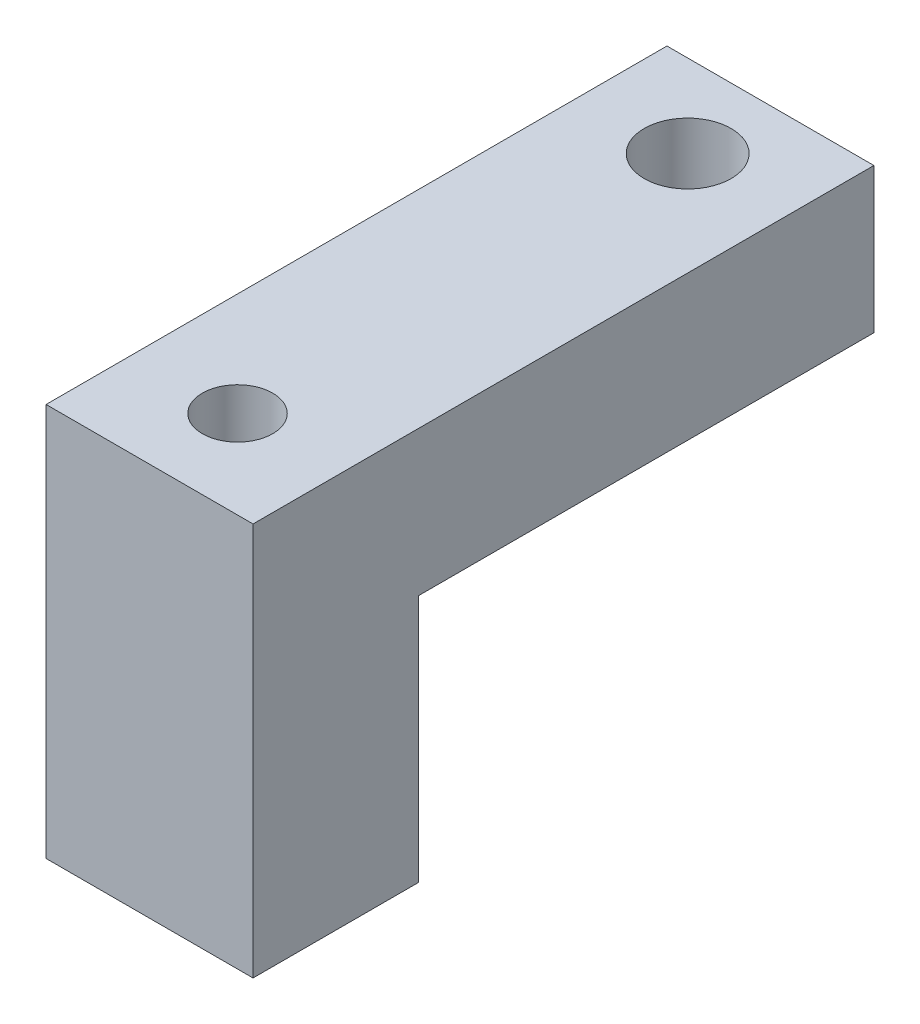
ISO-10303-21;
HEADER;
FILE_DESCRIPTION(('STEP AP214'),'2;1');
FILE_NAME('part.step','',(''),(''),'','','');
FILE_SCHEMA(('AUTOMOTIVE_DESIGN { 1 0 10303 214 1 1 1 1 }'));
ENDSEC;
DATA;
#1=APPLICATION_CONTEXT('core data for automotive mechanical design processes');
#2=APPLICATION_PROTOCOL_DEFINITION('international standard','automotive_design',2000,#1);
#3=PRODUCT_CONTEXT('',#1,'mechanical');
#4=PRODUCT('Part','Part','',(#3));
#5=PRODUCT_RELATED_PRODUCT_CATEGORY('part','',(#4));
#6=PRODUCT_DEFINITION_FORMATION('','',#4);
#7=PRODUCT_DEFINITION_CONTEXT('part definition',#1,'design');
#8=PRODUCT_DEFINITION('design','',#6,#7);
#9=PRODUCT_DEFINITION_SHAPE('','',#8);
#10=(LENGTH_UNIT() NAMED_UNIT(*) SI_UNIT(.MILLI.,.METRE.));
#11=(NAMED_UNIT(*) PLANE_ANGLE_UNIT() SI_UNIT($,.RADIAN.));
#12=(NAMED_UNIT(*) SI_UNIT($,.STERADIAN.) SOLID_ANGLE_UNIT());
#13=UNCERTAINTY_MEASURE_WITH_UNIT(LENGTH_MEASURE(1.E-05),#10,'distance_accuracy_value','');
#14=(GEOMETRIC_REPRESENTATION_CONTEXT(3) GLOBAL_UNCERTAINTY_ASSIGNED_CONTEXT((#13)) GLOBAL_UNIT_ASSIGNED_CONTEXT((#10,
#11,#12)) REPRESENTATION_CONTEXT('',''));
#15=CARTESIAN_POINT('',(0.,0.,0.));
#16=DIRECTION('',(0.,0.,1.));
#17=DIRECTION('',(1.,0.,0.));
#18=AXIS2_PLACEMENT_3D('',#15,#16,#17);
#19=CARTESIAN_POINT('',(0.,7.,0.));
#20=DIRECTION('',(0.,-1.,0.));
#21=DIRECTION('',(0.,0.,-1.));
#22=AXIS2_PLACEMENT_3D('',#19,#20,#21);
#23=PLANE('',#22);
#24=CARTESIAN_POINT('',(5.,7.,-4.25));
#25=DIRECTION('',(0.,1.,0.));
#26=DIRECTION('',(0.,0.,1.));
#27=AXIS2_PLACEMENT_3D('',#24,#25,#26);
#28=CIRCLE('',#27,1.7);
#29=CARTESIAN_POINT('',(5.,7.,-2.55));
#30=VERTEX_POINT('',#29);
#31=EDGE_CURVE('E153',#30,#30,#28,.T.);
#32=ORIENTED_EDGE('',*,*,#31,.F.);
#33=EDGE_LOOP('',(#32));
#34=FACE_BOUND('',#33,.T.);
#35=DIRECTION('',(0.,0.,1.));
#36=VECTOR('',#35,1.);
#37=CARTESIAN_POINT('',(0.,7.,0.));
#38=LINE('',#37,#36);
#39=CARTESIAN_POINT('',(0.,7.,-30.));
#40=VERTEX_POINT('',#39);
#41=CARTESIAN_POINT('',(0.,7.,0.));
#42=VERTEX_POINT('',#41);
#43=EDGE_CURVE('E131',#40,#42,#38,.T.);
#44=ORIENTED_EDGE('',*,*,#43,.T.);
#45=DIRECTION('',(1.,0.,0.));
#46=VECTOR('',#45,1.);
#47=CARTESIAN_POINT('',(0.,7.,0.));
#48=LINE('',#47,#46);
#49=CARTESIAN_POINT('',(10.,7.,0.));
#50=VERTEX_POINT('',#49);
#51=EDGE_CURVE('E83',#42,#50,#48,.T.);
#52=ORIENTED_EDGE('',*,*,#51,.T.);
#53=DIRECTION('',(0.,0.,-1.));
#54=VECTOR('',#53,1.);
#55=CARTESIAN_POINT('',(10.,7.,0.));
#56=LINE('',#55,#54);
#57=CARTESIAN_POINT('',(10.,7.,-30.));
#58=VERTEX_POINT('',#57);
#59=EDGE_CURVE('E134',#50,#58,#56,.T.);
#60=ORIENTED_EDGE('',*,*,#59,.T.);
#61=DIRECTION('',(-1.,0.,0.));
#62=VECTOR('',#61,1.);
#63=CARTESIAN_POINT('',(0.,7.,-30.));
#64=LINE('',#63,#62);
#65=EDGE_CURVE('E61',#58,#40,#64,.T.);
#66=ORIENTED_EDGE('',*,*,#65,.T.);
#67=EDGE_LOOP('',(#44,#52,#60,#66));
#68=FACE_BOUND('',#67,.T.);
#69=CARTESIAN_POINT('',(5.,7.,-26.));
#70=DIRECTION('',(0.,1.,0.));
#71=DIRECTION('',(0.,0.,1.));
#72=AXIS2_PLACEMENT_3D('',#69,#70,#71);
#73=CIRCLE('',#72,2.1);
#74=CARTESIAN_POINT('',(5.,7.,-23.9));
#75=VERTEX_POINT('',#74);
#76=EDGE_CURVE('E124',#75,#75,#73,.T.);
#77=ORIENTED_EDGE('',*,*,#76,.F.);
#78=EDGE_LOOP('',(#77));
#79=FACE_BOUND('',#78,.T.);
#80=ADVANCED_FACE('F37',(#34,#68,#79),#23,.F.);
#81=CARTESIAN_POINT('',(0.,0.,0.));
#82=DIRECTION('',(0.,-1.,0.));
#83=DIRECTION('',(0.,0.,-1.));
#84=AXIS2_PLACEMENT_3D('',#81,#82,#83);
#85=PLANE('',#84);
#86=DIRECTION('',(1.,0.,0.));
#87=VECTOR('',#86,1.);
#88=CARTESIAN_POINT('',(0.,0.,-8.));
#89=LINE('',#88,#87);
#90=CARTESIAN_POINT('',(0.,0.,-8.));
#91=VERTEX_POINT('',#90);
#92=CARTESIAN_POINT('',(10.,0.,-8.));
#93=VERTEX_POINT('',#92);
#94=EDGE_CURVE('E52',#91,#93,#89,.T.);
#95=ORIENTED_EDGE('',*,*,#94,.F.);
#96=DIRECTION('',(0.,0.,1.));
#97=VECTOR('',#96,1.);
#98=CARTESIAN_POINT('',(0.,0.,0.));
#99=LINE('',#98,#97);
#100=CARTESIAN_POINT('',(0.,0.,-30.));
#101=VERTEX_POINT('',#100);
#102=EDGE_CURVE('E120',#101,#91,#99,.T.);
#103=ORIENTED_EDGE('',*,*,#102,.F.);
#104=DIRECTION('',(-1.,0.,0.));
#105=VECTOR('',#104,1.);
#106=CARTESIAN_POINT('',(0.,0.,-30.));
#107=LINE('',#106,#105);
#108=CARTESIAN_POINT('',(10.,0.,-30.));
#109=VERTEX_POINT('',#108);
#110=EDGE_CURVE('E76',#109,#101,#107,.T.);
#111=ORIENTED_EDGE('',*,*,#110,.F.);
#112=DIRECTION('',(0.,0.,-1.));
#113=VECTOR('',#112,1.);
#114=CARTESIAN_POINT('',(10.,0.,0.));
#115=LINE('',#114,#113);
#116=EDGE_CURVE('E139',#93,#109,#115,.T.);
#117=ORIENTED_EDGE('',*,*,#116,.F.);
#118=EDGE_LOOP('',(#95,#103,#111,#117));
#119=FACE_BOUND('',#118,.T.);
#120=CARTESIAN_POINT('',(5.,0.,-26.));
#121=DIRECTION('',(0.,1.,0.));
#122=DIRECTION('',(0.,0.,1.));
#123=AXIS2_PLACEMENT_3D('',#120,#121,#122);
#124=CIRCLE('',#123,2.1);
#125=CARTESIAN_POINT('',(5.,0.,-23.9));
#126=VERTEX_POINT('',#125);
#127=EDGE_CURVE('E121',#126,#126,#124,.T.);
#128=ORIENTED_EDGE('',*,*,#127,.T.);
#129=EDGE_LOOP('',(#128));
#130=FACE_BOUND('',#129,.T.);
#131=ADVANCED_FACE('F164',(#119,#130),#85,.T.);
#132=CARTESIAN_POINT('',(0.,7.,0.));
#133=DIRECTION('',(1.,0.,0.));
#134=DIRECTION('',(0.,0.,-1.));
#135=AXIS2_PLACEMENT_3D('',#132,#133,#134);
#136=PLANE('',#135);
#137=ORIENTED_EDGE('',*,*,#102,.T.);
#138=DIRECTION('',(0.,1.,0.));
#139=VECTOR('',#138,1.);
#140=CARTESIAN_POINT('',(0.,-12.,-8.));
#141=LINE('',#140,#139);
#142=CARTESIAN_POINT('',(0.,-12.,-8.));
#143=VERTEX_POINT('',#142);
#144=EDGE_CURVE('E103',#143,#91,#141,.T.);
#145=ORIENTED_EDGE('',*,*,#144,.F.);
#146=DIRECTION('',(0.,0.,-1.));
#147=VECTOR('',#146,1.);
#148=CARTESIAN_POINT('',(0.,-12.,0.));
#149=LINE('',#148,#147);
#150=CARTESIAN_POINT('',(0.,-12.,0.));
#151=VERTEX_POINT('',#150);
#152=EDGE_CURVE('E110',#151,#143,#149,.T.);
#153=ORIENTED_EDGE('',*,*,#152,.F.);
#154=DIRECTION('',(0.,-1.,0.));
#155=VECTOR('',#154,1.);
#156=CARTESIAN_POINT('',(0.,7.,0.));
#157=LINE('',#156,#155);
#158=EDGE_CURVE('E11',#42,#151,#157,.T.);
#159=ORIENTED_EDGE('',*,*,#158,.F.);
#160=ORIENTED_EDGE('',*,*,#43,.F.);
#161=DIRECTION('',(0.,-1.,0.));
#162=VECTOR('',#161,1.);
#163=CARTESIAN_POINT('',(0.,7.,-30.));
#164=LINE('',#163,#162);
#165=EDGE_CURVE('E137',#40,#101,#164,.T.);
#166=ORIENTED_EDGE('',*,*,#165,.T.);
#167=EDGE_LOOP('',(#137,#145,#153,#159,#160,#166));
#168=FACE_BOUND('',#167,.T.);
#169=ADVANCED_FACE('F39',(#168),#136,.F.);
#170=CARTESIAN_POINT('',(0.,7.,0.));
#171=DIRECTION('',(0.,0.,-1.));
#172=DIRECTION('',(-1.,0.,0.));
#173=AXIS2_PLACEMENT_3D('',#170,#171,#172);
#174=PLANE('',#173);
#175=ORIENTED_EDGE('',*,*,#158,.T.);
#176=DIRECTION('',(-1.,0.,0.));
#177=VECTOR('',#176,1.);
#178=CARTESIAN_POINT('',(0.,-12.,0.));
#179=LINE('',#178,#177);
#180=CARTESIAN_POINT('',(10.,-12.,0.));
#181=VERTEX_POINT('',#180);
#182=EDGE_CURVE('E116',#181,#151,#179,.T.);
#183=ORIENTED_EDGE('',*,*,#182,.F.);
#184=DIRECTION('',(0.,-1.,0.));
#185=VECTOR('',#184,1.);
#186=CARTESIAN_POINT('',(10.,7.,0.));
#187=LINE('',#186,#185);
#188=EDGE_CURVE('E45',#50,#181,#187,.T.);
#189=ORIENTED_EDGE('',*,*,#188,.F.);
#190=ORIENTED_EDGE('',*,*,#51,.F.);
#191=EDGE_LOOP('',(#175,#183,#189,#190));
#192=FACE_BOUND('',#191,.T.);
#193=ADVANCED_FACE('F149',(#192),#174,.F.);
#194=CARTESIAN_POINT('',(10.,7.,0.));
#195=DIRECTION('',(-1.,0.,0.));
#196=DIRECTION('',(0.,0.,1.));
#197=AXIS2_PLACEMENT_3D('',#194,#195,#196);
#198=PLANE('',#197);
#199=ORIENTED_EDGE('',*,*,#188,.T.);
#200=DIRECTION('',(0.,0.,1.));
#201=VECTOR('',#200,1.);
#202=CARTESIAN_POINT('',(10.,-12.,0.));
#203=LINE('',#202,#201);
#204=CARTESIAN_POINT('',(10.,-12.,-8.));
#205=VERTEX_POINT('',#204);
#206=EDGE_CURVE('E109',#205,#181,#203,.T.);
#207=ORIENTED_EDGE('',*,*,#206,.F.);
#208=DIRECTION('',(0.,1.,0.));
#209=VECTOR('',#208,1.);
#210=CARTESIAN_POINT('',(10.,-12.,-8.));
#211=LINE('',#210,#209);
#212=EDGE_CURVE('E105',#205,#93,#211,.T.);
#213=ORIENTED_EDGE('',*,*,#212,.T.);
#214=ORIENTED_EDGE('',*,*,#116,.T.);
#215=DIRECTION('',(0.,-1.,0.));
#216=VECTOR('',#215,1.);
#217=CARTESIAN_POINT('',(10.,7.,-30.));
#218=LINE('',#217,#216);
#219=EDGE_CURVE('E143',#58,#109,#218,.T.);
#220=ORIENTED_EDGE('',*,*,#219,.F.);
#221=ORIENTED_EDGE('',*,*,#59,.F.);
#222=EDGE_LOOP('',(#199,#207,#213,#214,#220,#221));
#223=FACE_BOUND('',#222,.T.);
#224=ADVANCED_FACE('F146',(#223),#198,.F.);
#225=CARTESIAN_POINT('',(0.,7.,-30.));
#226=DIRECTION('',(0.,0.,1.));
#227=DIRECTION('',(1.,0.,0.));
#228=AXIS2_PLACEMENT_3D('',#225,#226,#227);
#229=PLANE('',#228);
#230=ORIENTED_EDGE('',*,*,#110,.T.);
#231=ORIENTED_EDGE('',*,*,#165,.F.);
#232=ORIENTED_EDGE('',*,*,#65,.F.);
#233=ORIENTED_EDGE('',*,*,#219,.T.);
#234=EDGE_LOOP('',(#230,#231,#232,#233));
#235=FACE_BOUND('',#234,.T.);
#236=ADVANCED_FACE('F173',(#235),#229,.F.);
#237=CARTESIAN_POINT('',(5.,7.,-26.));
#238=DIRECTION('',(0.,-1.,0.));
#239=DIRECTION('',(0.,0.,-1.));
#240=AXIS2_PLACEMENT_3D('',#237,#238,#239);
#241=CYLINDRICAL_SURFACE('',#240,2.1);
#242=ORIENTED_EDGE('',*,*,#76,.T.);
#243=EDGE_LOOP('',(#242));
#244=FACE_BOUND('',#243,.T.);
#245=ORIENTED_EDGE('',*,*,#127,.F.);
#246=EDGE_LOOP('',(#245));
#247=FACE_BOUND('',#246,.T.);
#248=ADVANCED_FACE('F170',(#244,#247),#241,.F.);
#249=CARTESIAN_POINT('',(0.,-12.,-8.));
#250=DIRECTION('',(0.,0.,1.));
#251=DIRECTION('',(1.,0.,0.));
#252=AXIS2_PLACEMENT_3D('',#249,#250,#251);
#253=PLANE('',#252);
#254=ORIENTED_EDGE('',*,*,#94,.T.);
#255=ORIENTED_EDGE('',*,*,#212,.F.);
#256=DIRECTION('',(1.,0.,0.));
#257=VECTOR('',#256,1.);
#258=CARTESIAN_POINT('',(0.,-12.,-8.));
#259=LINE('',#258,#257);
#260=EDGE_CURVE('E99',#143,#205,#259,.T.);
#261=ORIENTED_EDGE('',*,*,#260,.F.);
#262=ORIENTED_EDGE('',*,*,#144,.T.);
#263=EDGE_LOOP('',(#254,#255,#261,#262));
#264=FACE_BOUND('',#263,.T.);
#265=ADVANCED_FACE('F101',(#264),#253,.F.);
#266=CARTESIAN_POINT('',(0.,-12.,0.));
#267=DIRECTION('',(0.,-1.,0.));
#268=DIRECTION('',(0.,0.,-1.));
#269=AXIS2_PLACEMENT_3D('',#266,#267,#268);
#270=PLANE('',#269);
#271=CARTESIAN_POINT('',(5.,-12.,-4.25));
#272=DIRECTION('',(0.,1.,0.));
#273=DIRECTION('',(0.,0.,1.));
#274=AXIS2_PLACEMENT_3D('',#271,#272,#273);
#275=CIRCLE('',#274,1.7);
#276=CARTESIAN_POINT('',(5.,-12.,-2.55));
#277=VERTEX_POINT('',#276);
#278=EDGE_CURVE('E151',#277,#277,#275,.T.);
#279=ORIENTED_EDGE('',*,*,#278,.T.);
#280=EDGE_LOOP('',(#279));
#281=FACE_BOUND('',#280,.T.);
#282=ORIENTED_EDGE('',*,*,#152,.T.);
#283=ORIENTED_EDGE('',*,*,#260,.T.);
#284=ORIENTED_EDGE('',*,*,#206,.T.);
#285=ORIENTED_EDGE('',*,*,#182,.T.);
#286=EDGE_LOOP('',(#282,#283,#284,#285));
#287=FACE_BOUND('',#286,.T.);
#288=ADVANCED_FACE('F114',(#281,#287),#270,.T.);
#289=CARTESIAN_POINT('',(5.,-12.,-4.25));
#290=DIRECTION('',(0.,1.,0.));
#291=DIRECTION('',(0.,0.,1.));
#292=AXIS2_PLACEMENT_3D('',#289,#290,#291);
#293=CYLINDRICAL_SURFACE('',#292,1.7);
#294=ORIENTED_EDGE('',*,*,#278,.F.);
#295=EDGE_LOOP('',(#294));
#296=FACE_BOUND('',#295,.T.);
#297=ORIENTED_EDGE('',*,*,#31,.T.);
#298=EDGE_LOOP('',(#297));
#299=FACE_BOUND('',#298,.T.);
#300=ADVANCED_FACE('F161',(#296,#299),#293,.F.);
#301=CLOSED_SHELL('',(#80,#131,#169,#193,#224,#236,#248,#265,#288,#300));
#302=MANIFOLD_SOLID_BREP('B2',#301);
#303=ADVANCED_BREP_SHAPE_REPRESENTATION('',(#18,#302),#14);
#304=SHAPE_DEFINITION_REPRESENTATION(#9,#303);
ENDSEC;
END-ISO-10303-21;
